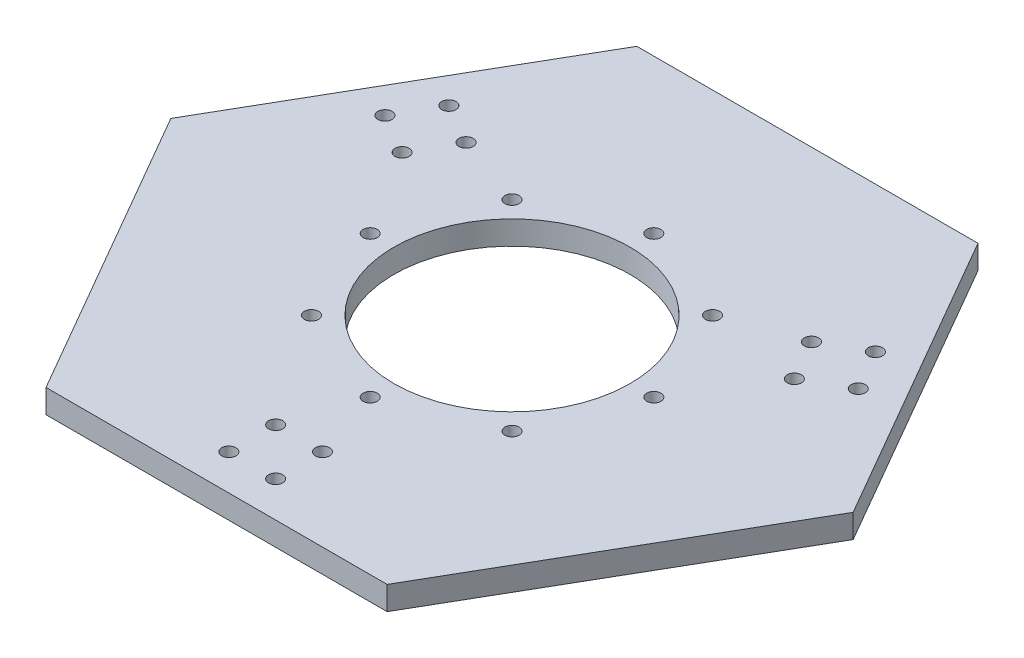
ISO-10303-21;
HEADER;
FILE_DESCRIPTION(('STEP AP214'),'2;1');
FILE_NAME('part.step','',(''),(''),'','','');
FILE_SCHEMA(('AUTOMOTIVE_DESIGN { 1 0 10303 214 1 1 1 1 }'));
ENDSEC;
DATA;
#1=APPLICATION_CONTEXT('core data for automotive mechanical design processes');
#2=APPLICATION_PROTOCOL_DEFINITION('international standard','automotive_design',2000,#1);
#3=PRODUCT_CONTEXT('',#1,'mechanical');
#4=PRODUCT('Part','Part','',(#3));
#5=PRODUCT_RELATED_PRODUCT_CATEGORY('part','',(#4));
#6=PRODUCT_DEFINITION_FORMATION('','',#4);
#7=PRODUCT_DEFINITION_CONTEXT('part definition',#1,'design');
#8=PRODUCT_DEFINITION('design','',#6,#7);
#9=PRODUCT_DEFINITION_SHAPE('','',#8);
#10=(LENGTH_UNIT() NAMED_UNIT(*) SI_UNIT(.MILLI.,.METRE.));
#11=(NAMED_UNIT(*) PLANE_ANGLE_UNIT() SI_UNIT($,.RADIAN.));
#12=(NAMED_UNIT(*) SI_UNIT($,.STERADIAN.) SOLID_ANGLE_UNIT());
#13=UNCERTAINTY_MEASURE_WITH_UNIT(LENGTH_MEASURE(1.E-05),#10,'distance_accuracy_value','');
#14=(GEOMETRIC_REPRESENTATION_CONTEXT(3) GLOBAL_UNCERTAINTY_ASSIGNED_CONTEXT((#13)) GLOBAL_UNIT_ASSIGNED_CONTEXT((#10,
#11,#12)) REPRESENTATION_CONTEXT('',''));
#15=CARTESIAN_POINT('',(0.,0.,0.));
#16=DIRECTION('',(0.,0.,1.));
#17=DIRECTION('',(1.,0.,0.));
#18=AXIS2_PLACEMENT_3D('',#15,#16,#17);
#19=CARTESIAN_POINT('',(72.1687836487032,5.,0.));
#20=DIRECTION('',(-0.866025403784438,0.,0.5));
#21=DIRECTION('',(0.5,0.,0.866025403784439));
#22=AXIS2_PLACEMENT_3D('',#19,#20,#21);
#23=PLANE('',#22);
#24=DIRECTION('',(-0.5,0.,-0.866025403784439));
#25=VECTOR('',#24,1.);
#26=CARTESIAN_POINT('',(72.1687836487032,0.,0.));
#27=LINE('',#26,#25);
#28=CARTESIAN_POINT('',(72.1687836487032,0.,0.));
#29=VERTEX_POINT('',#28);
#30=CARTESIAN_POINT('',(36.0843918243516,0.,-62.5));
#31=VERTEX_POINT('',#30);
#32=EDGE_CURVE('E122',#29,#31,#27,.T.);
#33=ORIENTED_EDGE('',*,*,#32,.T.);
#34=DIRECTION('',(0.,-1.,0.));
#35=VECTOR('',#34,1.);
#36=CARTESIAN_POINT('',(36.0843918243516,5.,-62.5));
#37=LINE('',#36,#35);
#38=CARTESIAN_POINT('',(36.0843918243516,5.,-62.5));
#39=VERTEX_POINT('',#38);
#40=EDGE_CURVE('E11',#39,#31,#37,.T.);
#41=ORIENTED_EDGE('',*,*,#40,.F.);
#42=DIRECTION('',(-0.5,0.,-0.866025403784439));
#43=VECTOR('',#42,1.);
#44=CARTESIAN_POINT('',(72.1687836487032,5.,0.));
#45=LINE('',#44,#43);
#46=CARTESIAN_POINT('',(72.1687836487032,5.,0.));
#47=VERTEX_POINT('',#46);
#48=EDGE_CURVE('E133',#47,#39,#45,.T.);
#49=ORIENTED_EDGE('',*,*,#48,.F.);
#50=DIRECTION('',(0.,-1.,0.));
#51=VECTOR('',#50,1.);
#52=CARTESIAN_POINT('',(72.1687836487032,5.,0.));
#53=LINE('',#52,#51);
#54=EDGE_CURVE('E118',#47,#29,#53,.T.);
#55=ORIENTED_EDGE('',*,*,#54,.T.);
#56=EDGE_LOOP('',(#33,#41,#49,#55));
#57=FACE_BOUND('',#56,.T.);
#58=ADVANCED_FACE('F38',(#57),#23,.F.);
#59=CARTESIAN_POINT('',(36.0843918243516,5.,-62.5));
#60=DIRECTION('',(0.,0.,1.));
#61=DIRECTION('',(1.,0.,0.));
#62=AXIS2_PLACEMENT_3D('',#59,#60,#61);
#63=PLANE('',#62);
#64=DIRECTION('',(-1.,0.,0.));
#65=VECTOR('',#64,1.);
#66=CARTESIAN_POINT('',(36.0843918243516,0.,-62.5));
#67=LINE('',#66,#65);
#68=CARTESIAN_POINT('',(-36.0843918243516,0.,-62.5));
#69=VERTEX_POINT('',#68);
#70=EDGE_CURVE('E125',#31,#69,#67,.T.);
#71=ORIENTED_EDGE('',*,*,#70,.T.);
#72=DIRECTION('',(0.,-1.,0.));
#73=VECTOR('',#72,1.);
#74=CARTESIAN_POINT('',(-36.0843918243516,5.,-62.5));
#75=LINE('',#74,#73);
#76=CARTESIAN_POINT('',(-36.0843918243516,5.,-62.5));
#77=VERTEX_POINT('',#76);
#78=EDGE_CURVE('E46',#77,#69,#75,.T.);
#79=ORIENTED_EDGE('',*,*,#78,.F.);
#80=DIRECTION('',(-1.,0.,0.));
#81=VECTOR('',#80,1.);
#82=CARTESIAN_POINT('',(36.0843918243516,5.,-62.5));
#83=LINE('',#82,#81);
#84=EDGE_CURVE('E91',#39,#77,#83,.T.);
#85=ORIENTED_EDGE('',*,*,#84,.F.);
#86=ORIENTED_EDGE('',*,*,#40,.T.);
#87=EDGE_LOOP('',(#71,#79,#85,#86));
#88=FACE_BOUND('',#87,.T.);
#89=ADVANCED_FACE('F159',(#88),#63,.F.);
#90=CARTESIAN_POINT('',(-36.0843918243516,5.,-62.5));
#91=DIRECTION('',(0.866025403784439,0.,0.5));
#92=DIRECTION('',(0.5,0.,-0.866025403784439));
#93=AXIS2_PLACEMENT_3D('',#90,#91,#92);
#94=PLANE('',#93);
#95=DIRECTION('',(-0.5,0.,0.866025403784439));
#96=VECTOR('',#95,1.);
#97=CARTESIAN_POINT('',(-36.0843918243516,0.,-62.5));
#98=LINE('',#97,#96);
#99=CARTESIAN_POINT('',(-72.1687836487032,0.,0.));
#100=VERTEX_POINT('',#99);
#101=EDGE_CURVE('E128',#69,#100,#98,.T.);
#102=ORIENTED_EDGE('',*,*,#101,.T.);
#103=DIRECTION('',(0.,-1.,0.));
#104=VECTOR('',#103,1.);
#105=CARTESIAN_POINT('',(-72.1687836487032,5.,0.));
#106=LINE('',#105,#104);
#107=CARTESIAN_POINT('',(-72.1687836487032,5.,0.));
#108=VERTEX_POINT('',#107);
#109=EDGE_CURVE('E113',#108,#100,#106,.T.);
#110=ORIENTED_EDGE('',*,*,#109,.F.);
#111=DIRECTION('',(-0.5,0.,0.866025403784439));
#112=VECTOR('',#111,1.);
#113=CARTESIAN_POINT('',(-36.0843918243516,5.,-62.5));
#114=LINE('',#113,#112);
#115=EDGE_CURVE('E104',#77,#108,#114,.T.);
#116=ORIENTED_EDGE('',*,*,#115,.F.);
#117=ORIENTED_EDGE('',*,*,#78,.T.);
#118=EDGE_LOOP('',(#102,#110,#116,#117));
#119=FACE_BOUND('',#118,.T.);
#120=ADVANCED_FACE('F139',(#119),#94,.F.);
#121=CARTESIAN_POINT('',(-72.1687836487032,5.,0.));
#122=DIRECTION('',(0.866025403784438,0.,-0.5));
#123=DIRECTION('',(-0.5,0.,-0.866025403784438));
#124=AXIS2_PLACEMENT_3D('',#121,#122,#123);
#125=PLANE('',#124);
#126=DIRECTION('',(0.5,0.,0.866025403784438));
#127=VECTOR('',#126,1.);
#128=CARTESIAN_POINT('',(-72.1687836487032,0.,0.));
#129=LINE('',#128,#127);
#130=CARTESIAN_POINT('',(-36.0843918243516,0.,62.5000000000001));
#131=VERTEX_POINT('',#130);
#132=EDGE_CURVE('E112',#100,#131,#129,.T.);
#133=ORIENTED_EDGE('',*,*,#132,.T.);
#134=DIRECTION('',(0.,-1.,0.));
#135=VECTOR('',#134,1.);
#136=CARTESIAN_POINT('',(-36.0843918243516,5.,62.5000000000001));
#137=LINE('',#136,#135);
#138=CARTESIAN_POINT('',(-36.0843918243516,5.,62.5000000000001));
#139=VERTEX_POINT('',#138);
#140=EDGE_CURVE('E109',#139,#131,#137,.T.);
#141=ORIENTED_EDGE('',*,*,#140,.F.);
#142=DIRECTION('',(0.5,0.,0.866025403784438));
#143=VECTOR('',#142,1.);
#144=CARTESIAN_POINT('',(-72.1687836487032,5.,0.));
#145=LINE('',#144,#143);
#146=EDGE_CURVE('E98',#108,#139,#145,.T.);
#147=ORIENTED_EDGE('',*,*,#146,.F.);
#148=ORIENTED_EDGE('',*,*,#109,.T.);
#149=EDGE_LOOP('',(#133,#141,#147,#148));
#150=FACE_BOUND('',#149,.T.);
#151=ADVANCED_FACE('F110',(#150),#125,.F.);
#152=CARTESIAN_POINT('',(-36.0843918243516,5.,62.5000000000001));
#153=DIRECTION('',(0.,0.,-1.));
#154=DIRECTION('',(-1.,0.,0.));
#155=AXIS2_PLACEMENT_3D('',#152,#153,#154);
#156=PLANE('',#155);
#157=DIRECTION('',(1.,0.,0.));
#158=VECTOR('',#157,1.);
#159=CARTESIAN_POINT('',(-36.0843918243516,0.,62.5000000000001));
#160=LINE('',#159,#158);
#161=CARTESIAN_POINT('',(36.0843918243516,0.,62.5));
#162=VERTEX_POINT('',#161);
#163=EDGE_CURVE('E77',#131,#162,#160,.T.);
#164=ORIENTED_EDGE('',*,*,#163,.T.);
#165=DIRECTION('',(0.,-1.,0.));
#166=VECTOR('',#165,1.);
#167=CARTESIAN_POINT('',(36.0843918243516,5.,62.5));
#168=LINE('',#167,#166);
#169=CARTESIAN_POINT('',(36.0843918243516,5.,62.5));
#170=VERTEX_POINT('',#169);
#171=EDGE_CURVE('E114',#170,#162,#168,.T.);
#172=ORIENTED_EDGE('',*,*,#171,.F.);
#173=DIRECTION('',(1.,0.,0.));
#174=VECTOR('',#173,1.);
#175=CARTESIAN_POINT('',(-36.0843918243516,5.,62.5000000000001));
#176=LINE('',#175,#174);
#177=EDGE_CURVE('E102',#139,#170,#176,.T.);
#178=ORIENTED_EDGE('',*,*,#177,.F.);
#179=ORIENTED_EDGE('',*,*,#140,.T.);
#180=EDGE_LOOP('',(#164,#172,#178,#179));
#181=FACE_BOUND('',#180,.T.);
#182=ADVANCED_FACE('F116',(#181),#156,.F.);
#183=CARTESIAN_POINT('',(36.0843918243516,5.,62.5));
#184=DIRECTION('',(-0.866025403784439,0.,-0.5));
#185=DIRECTION('',(-0.5,0.,0.866025403784439));
#186=AXIS2_PLACEMENT_3D('',#183,#184,#185);
#187=PLANE('',#186);
#188=DIRECTION('',(0.5,0.,-0.866025403784439));
#189=VECTOR('',#188,1.);
#190=CARTESIAN_POINT('',(36.0843918243516,0.,62.5));
#191=LINE('',#190,#189);
#192=EDGE_CURVE('E83',#162,#29,#191,.T.);
#193=ORIENTED_EDGE('',*,*,#192,.T.);
#194=ORIENTED_EDGE('',*,*,#54,.F.);
#195=DIRECTION('',(0.5,0.,-0.866025403784439));
#196=VECTOR('',#195,1.);
#197=CARTESIAN_POINT('',(36.0843918243516,5.,62.5));
#198=LINE('',#197,#196);
#199=EDGE_CURVE('E54',#170,#47,#198,.T.);
#200=ORIENTED_EDGE('',*,*,#199,.F.);
#201=ORIENTED_EDGE('',*,*,#171,.T.);
#202=EDGE_LOOP('',(#193,#194,#200,#201));
#203=FACE_BOUND('',#202,.T.);
#204=ADVANCED_FACE('F146',(#203),#187,.F.);
#205=CARTESIAN_POINT('',(0.,5.,0.));
#206=DIRECTION('',(0.,1.,0.));
#207=DIRECTION('',(0.,0.,1.));
#208=AXIS2_PLACEMENT_3D('',#205,#206,#207);
#209=PLANE('',#208);
#210=CARTESIAN_POINT('',(30.,5.,-1.04744440165294E-13));
#211=DIRECTION('',(0.,1.,0.));
#212=DIRECTION('',(0.,0.,1.));
#213=AXIS2_PLACEMENT_3D('',#210,#211,#212);
#214=CIRCLE('',#213,1.5);
#215=CARTESIAN_POINT('',(30.,5.,1.4999999999999));
#216=VERTEX_POINT('',#215);
#217=EDGE_CURVE('E483',#216,#216,#214,.T.);
#218=ORIENTED_EDGE('',*,*,#217,.F.);
#219=EDGE_LOOP('',(#218));
#220=FACE_BOUND('',#219,.T.);
#221=CARTESIAN_POINT('',(21.2132034355963,5.,-21.2132034355965));
#222=DIRECTION('',(0.,1.,0.));
#223=DIRECTION('',(0.,0.,1.));
#224=AXIS2_PLACEMENT_3D('',#221,#222,#223);
#225=CIRCLE('',#224,1.5);
#226=CARTESIAN_POINT('',(21.2132034355963,5.,-19.7132034355965));
#227=VERTEX_POINT('',#226);
#228=EDGE_CURVE('E520',#227,#227,#225,.T.);
#229=ORIENTED_EDGE('',*,*,#228,.F.);
#230=EDGE_LOOP('',(#229));
#231=FACE_BOUND('',#230,.T.);
#232=CARTESIAN_POINT('',(0.,5.,-30.));
#233=DIRECTION('',(0.,1.,0.));
#234=DIRECTION('',(0.,0.,1.));
#235=AXIS2_PLACEMENT_3D('',#232,#233,#234);
#236=CIRCLE('',#235,1.5);
#237=CARTESIAN_POINT('',(0.,5.,-28.5));
#238=VERTEX_POINT('',#237);
#239=EDGE_CURVE('E517',#238,#238,#236,.T.);
#240=ORIENTED_EDGE('',*,*,#239,.F.);
#241=EDGE_LOOP('',(#240));
#242=FACE_BOUND('',#241,.T.);
#243=CARTESIAN_POINT('',(-21.2132034355966,5.,-21.2132034355962));
#244=DIRECTION('',(0.,1.,0.));
#245=DIRECTION('',(0.,0.,1.));
#246=AXIS2_PLACEMENT_3D('',#243,#244,#245);
#247=CIRCLE('',#246,1.5);
#248=CARTESIAN_POINT('',(-21.2132034355966,5.,-19.7132034355962));
#249=VERTEX_POINT('',#248);
#250=EDGE_CURVE('E514',#249,#249,#247,.T.);
#251=ORIENTED_EDGE('',*,*,#250,.F.);
#252=EDGE_LOOP('',(#251));
#253=FACE_BOUND('',#252,.T.);
#254=CARTESIAN_POINT('',(-30.,5.,3.14233320495882E-13));
#255=DIRECTION('',(0.,1.,0.));
#256=DIRECTION('',(0.,0.,1.));
#257=AXIS2_PLACEMENT_3D('',#254,#255,#256);
#258=CIRCLE('',#257,1.5);
#259=CARTESIAN_POINT('',(-30.,5.,1.50000000000032));
#260=VERTEX_POINT('',#259);
#261=EDGE_CURVE('E511',#260,#260,#258,.T.);
#262=ORIENTED_EDGE('',*,*,#261,.F.);
#263=EDGE_LOOP('',(#262));
#264=FACE_BOUND('',#263,.T.);
#265=CARTESIAN_POINT('',(-21.2132034355962,5.,21.2132034355967));
#266=DIRECTION('',(0.,1.,0.));
#267=DIRECTION('',(0.,0.,1.));
#268=AXIS2_PLACEMENT_3D('',#265,#266,#267);
#269=CIRCLE('',#268,1.5);
#270=CARTESIAN_POINT('',(-21.2132034355962,5.,22.7132034355967));
#271=VERTEX_POINT('',#270);
#272=EDGE_CURVE('E508',#271,#271,#269,.T.);
#273=ORIENTED_EDGE('',*,*,#272,.F.);
#274=EDGE_LOOP('',(#273));
#275=FACE_BOUND('',#274,.T.);
#276=CARTESIAN_POINT('',(21.2132034355965,5.,21.2132034355964));
#277=DIRECTION('',(0.,1.,0.));
#278=DIRECTION('',(0.,0.,1.));
#279=AXIS2_PLACEMENT_3D('',#276,#277,#278);
#280=CIRCLE('',#279,1.5);
#281=CARTESIAN_POINT('',(21.2132034355965,5.,22.7132034355964));
#282=VERTEX_POINT('',#281);
#283=EDGE_CURVE('E491',#282,#282,#280,.T.);
#284=ORIENTED_EDGE('',*,*,#283,.F.);
#285=EDGE_LOOP('',(#284));
#286=FACE_BOUND('',#285,.T.);
#287=CARTESIAN_POINT('',(0.,5.,30.));
#288=DIRECTION('',(0.,1.,0.));
#289=DIRECTION('',(0.,0.,1.));
#290=AXIS2_PLACEMENT_3D('',#287,#288,#289);
#291=CIRCLE('',#290,1.5);
#292=CARTESIAN_POINT('',(0.,5.,31.5));
#293=VERTEX_POINT('',#292);
#294=EDGE_CURVE('E527',#293,#293,#291,.T.);
#295=ORIENTED_EDGE('',*,*,#294,.F.);
#296=EDGE_LOOP('',(#295));
#297=FACE_BOUND('',#296,.T.);
#298=CARTESIAN_POINT('',(41.4894444404891,5.,-18.2381742512666));
#299=DIRECTION('',(0.,1.,0.));
#300=DIRECTION('',(0.866025403784443,0.,-0.499999999999992));
#301=AXIS2_PLACEMENT_3D('',#298,#299,#300);
#302=CIRCLE('',#301,1.5);
#303=CARTESIAN_POINT('',(42.7884825461658,5.,-18.9881742512666));
#304=VERTEX_POINT('',#303);
#305=EDGE_CURVE('E534',#304,#304,#302,.T.);
#306=ORIENTED_EDGE('',*,*,#305,.F.);
#307=EDGE_LOOP('',(#306));
#308=FACE_BOUND('',#307,.T.);
#309=CARTESIAN_POINT('',(-50.0630959379548,5.,-23.1881742512673));
#310=DIRECTION('',(0.,1.,0.));
#311=DIRECTION('',(-0.866025403784436,0.,-0.500000000000004));
#312=AXIS2_PLACEMENT_3D('',#309,#310,#311);
#313=CIRCLE('',#312,1.5);
#314=CARTESIAN_POINT('',(-51.3621340436315,5.,-23.9381742512673));
#315=VERTEX_POINT('',#314);
#316=EDGE_CURVE('E553',#315,#315,#313,.T.);
#317=ORIENTED_EDGE('',*,*,#316,.F.);
#318=EDGE_LOOP('',(#317));
#319=FACE_BOUND('',#318,.T.);
#320=CARTESIAN_POINT('',(-45.1130959379548,5.,-31.7618257487332));
#321=DIRECTION('',(0.,1.,0.));
#322=DIRECTION('',(-0.866025403784436,0.,-0.500000000000004));
#323=AXIS2_PLACEMENT_3D('',#320,#321,#322);
#324=CIRCLE('',#323,1.5);
#325=CARTESIAN_POINT('',(-46.4121340436314,5.,-32.5118257487332));
#326=VERTEX_POINT('',#325);
#327=EDGE_CURVE('E552',#326,#326,#324,.T.);
#328=ORIENTED_EDGE('',*,*,#327,.F.);
#329=EDGE_LOOP('',(#328));
#330=FACE_BOUND('',#329,.T.);
#331=CARTESIAN_POINT('',(-41.4894444404889,5.,-18.2381742512672));
#332=DIRECTION('',(0.,1.,0.));
#333=DIRECTION('',(-0.866025403784436,0.,-0.500000000000004));
#334=AXIS2_PLACEMENT_3D('',#331,#332,#333);
#335=CIRCLE('',#334,1.5);
#336=CARTESIAN_POINT('',(-42.7884825461655,5.,-18.9881742512672));
#337=VERTEX_POINT('',#336);
#338=EDGE_CURVE('E565',#337,#337,#335,.T.);
#339=ORIENTED_EDGE('',*,*,#338,.F.);
#340=EDGE_LOOP('',(#339));
#341=FACE_BOUND('',#340,.T.);
#342=CARTESIAN_POINT('',(36.5394444404892,5.,-26.8118257487326));
#343=DIRECTION('',(0.,1.,0.));
#344=DIRECTION('',(0.866025403784443,0.,-0.499999999999992));
#345=AXIS2_PLACEMENT_3D('',#342,#343,#344);
#346=CIRCLE('',#345,1.5);
#347=CARTESIAN_POINT('',(37.8384825461659,5.,-27.5618257487326));
#348=VERTEX_POINT('',#347);
#349=EDGE_CURVE('E535',#348,#348,#346,.T.);
#350=ORIENTED_EDGE('',*,*,#349,.F.);
#351=EDGE_LOOP('',(#350));
#352=FACE_BOUND('',#351,.T.);
#353=CARTESIAN_POINT('',(50.0630959379551,5.,-23.1881742512666));
#354=DIRECTION('',(0.,1.,0.));
#355=DIRECTION('',(0.866025403784443,0.,-0.499999999999992));
#356=AXIS2_PLACEMENT_3D('',#353,#354,#355);
#357=CIRCLE('',#356,1.5);
#358=CARTESIAN_POINT('',(51.3621340436318,5.,-23.9381742512666));
#359=VERTEX_POINT('',#358);
#360=EDGE_CURVE('E541',#359,#359,#357,.T.);
#361=ORIENTED_EDGE('',*,*,#360,.F.);
#362=EDGE_LOOP('',(#361));
#363=FACE_BOUND('',#362,.T.);
#364=CARTESIAN_POINT('',(45.1130959379552,5.,-31.7618257487326));
#365=DIRECTION('',(0.,1.,0.));
#366=DIRECTION('',(0.866025403784443,0.,-0.499999999999992));
#367=AXIS2_PLACEMENT_3D('',#364,#365,#366);
#368=CIRCLE('',#367,1.5);
#369=CARTESIAN_POINT('',(46.4121340436319,5.,-32.5118257487325));
#370=VERTEX_POINT('',#369);
#371=EDGE_CURVE('E530',#370,#370,#368,.T.);
#372=ORIENTED_EDGE('',*,*,#371,.F.);
#373=EDGE_LOOP('',(#372));
#374=FACE_BOUND('',#373,.T.);
#375=CARTESIAN_POINT('',(-36.5394444404888,5.,-26.8118257487331));
#376=DIRECTION('',(0.,1.,0.));
#377=DIRECTION('',(-0.866025403784436,0.,-0.500000000000004));
#378=AXIS2_PLACEMENT_3D('',#375,#376,#377);
#379=CIRCLE('',#378,1.5);
#380=CARTESIAN_POINT('',(-37.8384825461655,5.,-27.5618257487331));
#381=VERTEX_POINT('',#380);
#382=EDGE_CURVE('E564',#381,#381,#379,.T.);
#383=ORIENTED_EDGE('',*,*,#382,.F.);
#384=EDGE_LOOP('',(#383));
#385=FACE_BOUND('',#384,.T.);
#386=CARTESIAN_POINT('',(4.95,5.,45.05));
#387=DIRECTION('',(0.,1.,0.));
#388=DIRECTION('',(0.,0.,1.));
#389=AXIS2_PLACEMENT_3D('',#386,#387,#388);
#390=CIRCLE('',#389,1.5);
#391=CARTESIAN_POINT('',(4.95,5.,46.55));
#392=VERTEX_POINT('',#391);
#393=EDGE_CURVE('E585',#392,#392,#390,.T.);
#394=ORIENTED_EDGE('',*,*,#393,.F.);
#395=EDGE_LOOP('',(#394));
#396=FACE_BOUND('',#395,.T.);
#397=CARTESIAN_POINT('',(-4.95,5.,54.95));
#398=DIRECTION('',(0.,1.,0.));
#399=DIRECTION('',(0.,0.,1.));
#400=AXIS2_PLACEMENT_3D('',#397,#398,#399);
#401=CIRCLE('',#400,1.5);
#402=CARTESIAN_POINT('',(-4.95,5.,56.45));
#403=VERTEX_POINT('',#402);
#404=EDGE_CURVE('E592',#403,#403,#401,.T.);
#405=ORIENTED_EDGE('',*,*,#404,.F.);
#406=EDGE_LOOP('',(#405));
#407=FACE_BOUND('',#406,.T.);
#408=CARTESIAN_POINT('',(4.95,5.,54.95));
#409=DIRECTION('',(0.,1.,0.));
#410=DIRECTION('',(0.,0.,1.));
#411=AXIS2_PLACEMENT_3D('',#408,#409,#410);
#412=CIRCLE('',#411,1.5);
#413=CARTESIAN_POINT('',(4.95,5.,56.45));
#414=VERTEX_POINT('',#413);
#415=EDGE_CURVE('E579',#414,#414,#412,.T.);
#416=ORIENTED_EDGE('',*,*,#415,.F.);
#417=EDGE_LOOP('',(#416));
#418=FACE_BOUND('',#417,.T.);
#419=CARTESIAN_POINT('',(-4.95,5.,45.05));
#420=DIRECTION('',(0.,1.,0.));
#421=DIRECTION('',(0.,0.,1.));
#422=AXIS2_PLACEMENT_3D('',#419,#420,#421);
#423=CIRCLE('',#422,1.5);
#424=CARTESIAN_POINT('',(-4.95,5.,46.55));
#425=VERTEX_POINT('',#424);
#426=EDGE_CURVE('E588',#425,#425,#423,.T.);
#427=ORIENTED_EDGE('',*,*,#426,.F.);
#428=EDGE_LOOP('',(#427));
#429=FACE_BOUND('',#428,.T.);
#430=CARTESIAN_POINT('',(0.,5.,0.));
#431=DIRECTION('',(0.,1.,0.));
#432=DIRECTION('',(0.,0.,1.));
#433=AXIS2_PLACEMENT_3D('',#430,#431,#432);
#434=CIRCLE('',#433,25.);
#435=CARTESIAN_POINT('',(0.,5.,25.));
#436=VERTEX_POINT('',#435);
#437=EDGE_CURVE('E600',#436,#436,#434,.T.);
#438=ORIENTED_EDGE('',*,*,#437,.F.);
#439=EDGE_LOOP('',(#438));
#440=FACE_BOUND('',#439,.T.);
#441=ORIENTED_EDGE('',*,*,#48,.T.);
#442=ORIENTED_EDGE('',*,*,#84,.T.);
#443=ORIENTED_EDGE('',*,*,#115,.T.);
#444=ORIENTED_EDGE('',*,*,#146,.T.);
#445=ORIENTED_EDGE('',*,*,#177,.T.);
#446=ORIENTED_EDGE('',*,*,#199,.T.);
#447=EDGE_LOOP('',(#441,#442,#443,#444,#445,#446));
#448=FACE_BOUND('',#447,.T.);
#449=ADVANCED_FACE('F100',(#220,#231,#242,#253,#264,#275,#286,#297,#308,#319,#330,#341,#352,
#363,#374,#385,#396,#407,#418,#429,#440,#448),#209,.T.);
#450=CARTESIAN_POINT('',(0.,0.,0.));
#451=DIRECTION('',(0.,1.,0.));
#452=DIRECTION('',(0.,0.,1.));
#453=AXIS2_PLACEMENT_3D('',#450,#451,#452);
#454=PLANE('',#453);
#455=CARTESIAN_POINT('',(30.,0.,-1.04744440165294E-13));
#456=DIRECTION('',(0.,-1.,0.));
#457=DIRECTION('',(-1.,0.,0.));
#458=AXIS2_PLACEMENT_3D('',#455,#456,#457);
#459=CIRCLE('',#458,1.5);
#460=CARTESIAN_POINT('',(28.5,0.,0.));
#461=VERTEX_POINT('',#460);
#462=EDGE_CURVE('E486',#461,#461,#459,.T.);
#463=ORIENTED_EDGE('',*,*,#462,.F.);
#464=EDGE_LOOP('',(#463));
#465=FACE_BOUND('',#464,.T.);
#466=CARTESIAN_POINT('',(21.2132034355963,0.,-21.2132034355965));
#467=DIRECTION('',(0.,-1.,0.));
#468=DIRECTION('',(-0.707106781186544,0.,0.707106781186551));
#469=AXIS2_PLACEMENT_3D('',#466,#467,#468);
#470=CIRCLE('',#469,1.5);
#471=CARTESIAN_POINT('',(20.1525432638165,0.,-20.1525432638167));
#472=VERTEX_POINT('',#471);
#473=EDGE_CURVE('E488',#472,#472,#470,.T.);
#474=ORIENTED_EDGE('',*,*,#473,.F.);
#475=EDGE_LOOP('',(#474));
#476=FACE_BOUND('',#475,.T.);
#477=CARTESIAN_POINT('',(0.,0.,-30.));
#478=DIRECTION('',(0.,-1.,0.));
#479=DIRECTION('',(0.,0.,1.));
#480=AXIS2_PLACEMENT_3D('',#477,#478,#479);
#481=CIRCLE('',#480,1.5);
#482=CARTESIAN_POINT('',(0.,0.,-28.5));
#483=VERTEX_POINT('',#482);
#484=EDGE_CURVE('E494',#483,#483,#481,.T.);
#485=ORIENTED_EDGE('',*,*,#484,.F.);
#486=EDGE_LOOP('',(#485));
#487=FACE_BOUND('',#486,.T.);
#488=CARTESIAN_POINT('',(-21.2132034355966,0.,-21.2132034355962));
#489=DIRECTION('',(0.,-1.,0.));
#490=DIRECTION('',(0.707106781186554,0.,0.707106781186541));
#491=AXIS2_PLACEMENT_3D('',#488,#489,#490);
#492=CIRCLE('',#491,1.5);
#493=CARTESIAN_POINT('',(-20.1525432638168,0.,-20.1525432638164));
#494=VERTEX_POINT('',#493);
#495=EDGE_CURVE('E502',#494,#494,#492,.T.);
#496=ORIENTED_EDGE('',*,*,#495,.F.);
#497=EDGE_LOOP('',(#496));
#498=FACE_BOUND('',#497,.T.);
#499=CARTESIAN_POINT('',(-30.,0.,3.14233320495882E-13));
#500=DIRECTION('',(0.,-1.,0.));
#501=DIRECTION('',(1.,0.,0.));
#502=AXIS2_PLACEMENT_3D('',#499,#500,#501);
#503=CIRCLE('',#502,1.5);
#504=CARTESIAN_POINT('',(-28.5,0.,2.98521654471088E-13));
#505=VERTEX_POINT('',#504);
#506=EDGE_CURVE('E504',#505,#505,#503,.T.);
#507=ORIENTED_EDGE('',*,*,#506,.F.);
#508=EDGE_LOOP('',(#507));
#509=FACE_BOUND('',#508,.T.);
#510=CARTESIAN_POINT('',(-21.2132034355962,0.,21.2132034355967));
#511=DIRECTION('',(0.,-1.,0.));
#512=DIRECTION('',(0.707106781186539,0.,-0.707106781186556));
#513=AXIS2_PLACEMENT_3D('',#510,#511,#512);
#514=CIRCLE('',#513,1.5);
#515=CARTESIAN_POINT('',(-20.1525432638164,0.,20.1525432638168));
#516=VERTEX_POINT('',#515);
#517=EDGE_CURVE('E497',#516,#516,#514,.T.);
#518=ORIENTED_EDGE('',*,*,#517,.F.);
#519=EDGE_LOOP('',(#518));
#520=FACE_BOUND('',#519,.T.);
#521=CARTESIAN_POINT('',(21.2132034355965,0.,21.2132034355964));
#522=DIRECTION('',(0.,-1.,0.));
#523=DIRECTION('',(-0.707106781186549,0.,-0.707106781186546));
#524=AXIS2_PLACEMENT_3D('',#521,#522,#523);
#525=CIRCLE('',#524,1.5);
#526=CARTESIAN_POINT('',(20.1525432638166,0.,20.1525432638166));
#527=VERTEX_POINT('',#526);
#528=EDGE_CURVE('E487',#527,#527,#525,.T.);
#529=ORIENTED_EDGE('',*,*,#528,.F.);
#530=EDGE_LOOP('',(#529));
#531=FACE_BOUND('',#530,.T.);
#532=CARTESIAN_POINT('',(0.,0.,30.));
#533=DIRECTION('',(0.,-1.,0.));
#534=DIRECTION('',(0.,0.,-1.));
#535=AXIS2_PLACEMENT_3D('',#532,#533,#534);
#536=CIRCLE('',#535,1.5);
#537=CARTESIAN_POINT('',(0.,0.,28.5));
#538=VERTEX_POINT('',#537);
#539=EDGE_CURVE('E524',#538,#538,#536,.T.);
#540=ORIENTED_EDGE('',*,*,#539,.F.);
#541=EDGE_LOOP('',(#540));
#542=FACE_BOUND('',#541,.T.);
#543=CARTESIAN_POINT('',(41.4894444404891,0.,-18.2381742512666));
#544=DIRECTION('',(0.,1.,0.));
#545=DIRECTION('',(0.866025403784443,0.,-0.499999999999992));
#546=AXIS2_PLACEMENT_3D('',#543,#544,#545);
#547=CIRCLE('',#546,1.5);
#548=CARTESIAN_POINT('',(42.7884825461658,0.,-18.9881742512666));
#549=VERTEX_POINT('',#548);
#550=EDGE_CURVE('E556',#549,#549,#547,.T.);
#551=ORIENTED_EDGE('',*,*,#550,.T.);
#552=EDGE_LOOP('',(#551));
#553=FACE_BOUND('',#552,.T.);
#554=CARTESIAN_POINT('',(-50.0630959379548,0.,-23.1881742512673));
#555=DIRECTION('',(0.,1.,0.));
#556=DIRECTION('',(-0.866025403784436,0.,-0.500000000000004));
#557=AXIS2_PLACEMENT_3D('',#554,#555,#556);
#558=CIRCLE('',#557,1.5);
#559=CARTESIAN_POINT('',(-51.3621340436315,0.,-23.9381742512673));
#560=VERTEX_POINT('',#559);
#561=EDGE_CURVE('E549',#560,#560,#558,.T.);
#562=ORIENTED_EDGE('',*,*,#561,.T.);
#563=EDGE_LOOP('',(#562));
#564=FACE_BOUND('',#563,.T.);
#565=CARTESIAN_POINT('',(-45.1130959379548,0.,-31.7618257487332));
#566=DIRECTION('',(0.,1.,0.));
#567=DIRECTION('',(-0.866025403784436,0.,-0.500000000000004));
#568=AXIS2_PLACEMENT_3D('',#565,#566,#567);
#569=CIRCLE('',#568,1.5);
#570=CARTESIAN_POINT('',(-46.4121340436314,0.,-32.5118257487332));
#571=VERTEX_POINT('',#570);
#572=EDGE_CURVE('E568',#571,#571,#569,.T.);
#573=ORIENTED_EDGE('',*,*,#572,.T.);
#574=EDGE_LOOP('',(#573));
#575=FACE_BOUND('',#574,.T.);
#576=CARTESIAN_POINT('',(-41.4894444404889,0.,-18.2381742512672));
#577=DIRECTION('',(0.,1.,0.));
#578=DIRECTION('',(-0.866025403784436,0.,-0.500000000000004));
#579=AXIS2_PLACEMENT_3D('',#576,#577,#578);
#580=CIRCLE('',#579,1.5);
#581=CARTESIAN_POINT('',(-42.7884825461655,0.,-18.9881742512672));
#582=VERTEX_POINT('',#581);
#583=EDGE_CURVE('E561',#582,#582,#580,.T.);
#584=ORIENTED_EDGE('',*,*,#583,.T.);
#585=EDGE_LOOP('',(#584));
#586=FACE_BOUND('',#585,.T.);
#587=CARTESIAN_POINT('',(36.5394444404892,0.,-26.8118257487326));
#588=DIRECTION('',(0.,1.,0.));
#589=DIRECTION('',(0.866025403784443,0.,-0.499999999999992));
#590=AXIS2_PLACEMENT_3D('',#587,#588,#589);
#591=CIRCLE('',#590,1.5);
#592=CARTESIAN_POINT('',(37.8384825461659,0.,-27.5618257487326));
#593=VERTEX_POINT('',#592);
#594=EDGE_CURVE('E531',#593,#593,#591,.T.);
#595=ORIENTED_EDGE('',*,*,#594,.T.);
#596=EDGE_LOOP('',(#595));
#597=FACE_BOUND('',#596,.T.);
#598=CARTESIAN_POINT('',(50.0630959379551,0.,-23.1881742512666));
#599=DIRECTION('',(0.,1.,0.));
#600=DIRECTION('',(0.866025403784443,0.,-0.499999999999992));
#601=AXIS2_PLACEMENT_3D('',#598,#599,#600);
#602=CIRCLE('',#601,1.5);
#603=CARTESIAN_POINT('',(51.3621340436318,0.,-23.9381742512666));
#604=VERTEX_POINT('',#603);
#605=EDGE_CURVE('E538',#604,#604,#602,.T.);
#606=ORIENTED_EDGE('',*,*,#605,.T.);
#607=EDGE_LOOP('',(#606));
#608=FACE_BOUND('',#607,.T.);
#609=CARTESIAN_POINT('',(45.1130959379552,0.,-31.7618257487326));
#610=DIRECTION('',(0.,1.,0.));
#611=DIRECTION('',(0.866025403784443,0.,-0.499999999999992));
#612=AXIS2_PLACEMENT_3D('',#609,#610,#611);
#613=CIRCLE('',#612,1.5);
#614=CARTESIAN_POINT('',(46.4121340436319,0.,-32.5118257487325));
#615=VERTEX_POINT('',#614);
#616=EDGE_CURVE('E544',#615,#615,#613,.T.);
#617=ORIENTED_EDGE('',*,*,#616,.T.);
#618=EDGE_LOOP('',(#617));
#619=FACE_BOUND('',#618,.T.);
#620=CARTESIAN_POINT('',(-36.5394444404888,0.,-26.8118257487331));
#621=DIRECTION('',(0.,1.,0.));
#622=DIRECTION('',(-0.866025403784436,0.,-0.500000000000004));
#623=AXIS2_PLACEMENT_3D('',#620,#621,#622);
#624=CIRCLE('',#623,1.5);
#625=CARTESIAN_POINT('',(-37.8384825461655,0.,-27.5618257487331));
#626=VERTEX_POINT('',#625);
#627=EDGE_CURVE('E573',#626,#626,#624,.T.);
#628=ORIENTED_EDGE('',*,*,#627,.T.);
#629=EDGE_LOOP('',(#628));
#630=FACE_BOUND('',#629,.T.);
#631=CARTESIAN_POINT('',(4.95,0.,45.05));
#632=DIRECTION('',(0.,1.,0.));
#633=DIRECTION('',(0.,0.,1.));
#634=AXIS2_PLACEMENT_3D('',#631,#632,#633);
#635=CIRCLE('',#634,1.5);
#636=CARTESIAN_POINT('',(4.95,0.,46.55));
#637=VERTEX_POINT('',#636);
#638=EDGE_CURVE('E589',#637,#637,#635,.T.);
#639=ORIENTED_EDGE('',*,*,#638,.T.);
#640=EDGE_LOOP('',(#639));
#641=FACE_BOUND('',#640,.T.);
#642=CARTESIAN_POINT('',(-4.95,0.,54.95));
#643=DIRECTION('',(0.,1.,0.));
#644=DIRECTION('',(0.,0.,1.));
#645=AXIS2_PLACEMENT_3D('',#642,#643,#644);
#646=CIRCLE('',#645,1.5);
#647=CARTESIAN_POINT('',(-4.95,0.,56.45));
#648=VERTEX_POINT('',#647);
#649=EDGE_CURVE('E582',#648,#648,#646,.T.);
#650=ORIENTED_EDGE('',*,*,#649,.T.);
#651=EDGE_LOOP('',(#650));
#652=FACE_BOUND('',#651,.T.);
#653=CARTESIAN_POINT('',(4.95,0.,54.95));
#654=DIRECTION('',(0.,1.,0.));
#655=DIRECTION('',(0.,0.,1.));
#656=AXIS2_PLACEMENT_3D('',#653,#654,#655);
#657=CIRCLE('',#656,1.5);
#658=CARTESIAN_POINT('',(4.95,0.,56.45));
#659=VERTEX_POINT('',#658);
#660=EDGE_CURVE('E576',#659,#659,#657,.T.);
#661=ORIENTED_EDGE('',*,*,#660,.T.);
#662=EDGE_LOOP('',(#661));
#663=FACE_BOUND('',#662,.T.);
#664=CARTESIAN_POINT('',(-4.95,0.,45.05));
#665=DIRECTION('',(0.,1.,0.));
#666=DIRECTION('',(0.,0.,1.));
#667=AXIS2_PLACEMENT_3D('',#664,#665,#666);
#668=CIRCLE('',#667,1.5);
#669=CARTESIAN_POINT('',(-4.95,0.,46.55));
#670=VERTEX_POINT('',#669);
#671=EDGE_CURVE('E597',#670,#670,#668,.T.);
#672=ORIENTED_EDGE('',*,*,#671,.T.);
#673=EDGE_LOOP('',(#672));
#674=FACE_BOUND('',#673,.T.);
#675=CARTESIAN_POINT('',(0.,0.,0.));
#676=DIRECTION('',(0.,1.,0.));
#677=DIRECTION('',(0.,0.,1.));
#678=AXIS2_PLACEMENT_3D('',#675,#676,#677);
#679=CIRCLE('',#678,25.);
#680=CARTESIAN_POINT('',(0.,0.,25.));
#681=VERTEX_POINT('',#680);
#682=EDGE_CURVE('E126',#681,#681,#679,.T.);
#683=ORIENTED_EDGE('',*,*,#682,.T.);
#684=EDGE_LOOP('',(#683));
#685=FACE_BOUND('',#684,.T.);
#686=ORIENTED_EDGE('',*,*,#32,.F.);
#687=ORIENTED_EDGE('',*,*,#192,.F.);
#688=ORIENTED_EDGE('',*,*,#163,.F.);
#689=ORIENTED_EDGE('',*,*,#132,.F.);
#690=ORIENTED_EDGE('',*,*,#101,.F.);
#691=ORIENTED_EDGE('',*,*,#70,.F.);
#692=EDGE_LOOP('',(#686,#687,#688,#689,#690,#691));
#693=FACE_BOUND('',#692,.T.);
#694=ADVANCED_FACE('F142',(#465,#476,#487,#498,#509,#520,#531,#542,#553,#564,#575,#586,#597,
#608,#619,#630,#641,#652,#663,#674,#685,#693),#454,.F.);
#695=CARTESIAN_POINT('',(0.,0.,0.));
#696=DIRECTION('',(0.,1.,0.));
#697=DIRECTION('',(0.,0.,1.));
#698=AXIS2_PLACEMENT_3D('',#695,#696,#697);
#699=CYLINDRICAL_SURFACE('',#698,25.);
#700=ORIENTED_EDGE('',*,*,#682,.F.);
#701=EDGE_LOOP('',(#700));
#702=FACE_BOUND('',#701,.T.);
#703=ORIENTED_EDGE('',*,*,#437,.T.);
#704=EDGE_LOOP('',(#703));
#705=FACE_BOUND('',#704,.T.);
#706=ADVANCED_FACE('F189',(#702,#705),#699,.F.);
#707=CARTESIAN_POINT('',(-4.95,0.,45.05));
#708=DIRECTION('',(0.,1.,0.));
#709=DIRECTION('',(0.,0.,1.));
#710=AXIS2_PLACEMENT_3D('',#707,#708,#709);
#711=CYLINDRICAL_SURFACE('',#710,1.5);
#712=ORIENTED_EDGE('',*,*,#671,.F.);
#713=EDGE_LOOP('',(#712));
#714=FACE_BOUND('',#713,.T.);
#715=ORIENTED_EDGE('',*,*,#426,.T.);
#716=EDGE_LOOP('',(#715));
#717=FACE_BOUND('',#716,.T.);
#718=ADVANCED_FACE('F194',(#714,#717),#711,.F.);
#719=CARTESIAN_POINT('',(4.95,0.,54.95));
#720=DIRECTION('',(0.,1.,0.));
#721=DIRECTION('',(0.,0.,1.));
#722=AXIS2_PLACEMENT_3D('',#719,#720,#721);
#723=CYLINDRICAL_SURFACE('',#722,1.5);
#724=ORIENTED_EDGE('',*,*,#660,.F.);
#725=EDGE_LOOP('',(#724));
#726=FACE_BOUND('',#725,.T.);
#727=ORIENTED_EDGE('',*,*,#415,.T.);
#728=EDGE_LOOP('',(#727));
#729=FACE_BOUND('',#728,.T.);
#730=ADVANCED_FACE('F207',(#726,#729),#723,.F.);
#731=CARTESIAN_POINT('',(-4.95,0.,54.95));
#732=DIRECTION('',(0.,1.,0.));
#733=DIRECTION('',(0.,0.,1.));
#734=AXIS2_PLACEMENT_3D('',#731,#732,#733);
#735=CYLINDRICAL_SURFACE('',#734,1.5);
#736=ORIENTED_EDGE('',*,*,#649,.F.);
#737=EDGE_LOOP('',(#736));
#738=FACE_BOUND('',#737,.T.);
#739=ORIENTED_EDGE('',*,*,#404,.T.);
#740=EDGE_LOOP('',(#739));
#741=FACE_BOUND('',#740,.T.);
#742=ADVANCED_FACE('F218',(#738,#741),#735,.F.);
#743=CARTESIAN_POINT('',(4.95,0.,45.05));
#744=DIRECTION('',(0.,1.,0.));
#745=DIRECTION('',(0.,0.,1.));
#746=AXIS2_PLACEMENT_3D('',#743,#744,#745);
#747=CYLINDRICAL_SURFACE('',#746,1.5);
#748=ORIENTED_EDGE('',*,*,#638,.F.);
#749=EDGE_LOOP('',(#748));
#750=FACE_BOUND('',#749,.T.);
#751=ORIENTED_EDGE('',*,*,#393,.T.);
#752=EDGE_LOOP('',(#751));
#753=FACE_BOUND('',#752,.T.);
#754=ADVANCED_FACE('F229',(#750,#753),#747,.F.);
#755=CARTESIAN_POINT('',(-36.5394444404888,0.,-26.8118257487331));
#756=DIRECTION('',(0.,1.,0.));
#757=DIRECTION('',(0.,0.,1.));
#758=AXIS2_PLACEMENT_3D('',#755,#756,#757);
#759=CYLINDRICAL_SURFACE('',#758,1.5);
#760=ORIENTED_EDGE('',*,*,#627,.F.);
#761=EDGE_LOOP('',(#760));
#762=FACE_BOUND('',#761,.T.);
#763=ORIENTED_EDGE('',*,*,#382,.T.);
#764=EDGE_LOOP('',(#763));
#765=FACE_BOUND('',#764,.T.);
#766=ADVANCED_FACE('F240',(#762,#765),#759,.F.);
#767=CARTESIAN_POINT('',(45.1130959379552,0.,-31.7618257487326));
#768=DIRECTION('',(0.,1.,0.));
#769=DIRECTION('',(0.,0.,1.));
#770=AXIS2_PLACEMENT_3D('',#767,#768,#769);
#771=CYLINDRICAL_SURFACE('',#770,1.5);
#772=ORIENTED_EDGE('',*,*,#616,.F.);
#773=EDGE_LOOP('',(#772));
#774=FACE_BOUND('',#773,.T.);
#775=ORIENTED_EDGE('',*,*,#371,.T.);
#776=EDGE_LOOP('',(#775));
#777=FACE_BOUND('',#776,.T.);
#778=ADVANCED_FACE('F251',(#774,#777),#771,.F.);
#779=CARTESIAN_POINT('',(50.0630959379551,0.,-23.1881742512666));
#780=DIRECTION('',(0.,1.,0.));
#781=DIRECTION('',(0.,0.,1.));
#782=AXIS2_PLACEMENT_3D('',#779,#780,#781);
#783=CYLINDRICAL_SURFACE('',#782,1.5);
#784=ORIENTED_EDGE('',*,*,#605,.F.);
#785=EDGE_LOOP('',(#784));
#786=FACE_BOUND('',#785,.T.);
#787=ORIENTED_EDGE('',*,*,#360,.T.);
#788=EDGE_LOOP('',(#787));
#789=FACE_BOUND('',#788,.T.);
#790=ADVANCED_FACE('F262',(#786,#789),#783,.F.);
#791=CARTESIAN_POINT('',(36.5394444404892,0.,-26.8118257487326));
#792=DIRECTION('',(0.,1.,0.));
#793=DIRECTION('',(0.,0.,1.));
#794=AXIS2_PLACEMENT_3D('',#791,#792,#793);
#795=CYLINDRICAL_SURFACE('',#794,1.5);
#796=ORIENTED_EDGE('',*,*,#594,.F.);
#797=EDGE_LOOP('',(#796));
#798=FACE_BOUND('',#797,.T.);
#799=ORIENTED_EDGE('',*,*,#349,.T.);
#800=EDGE_LOOP('',(#799));
#801=FACE_BOUND('',#800,.T.);
#802=ADVANCED_FACE('F273',(#798,#801),#795,.F.);
#803=CARTESIAN_POINT('',(-41.4894444404889,0.,-18.2381742512672));
#804=DIRECTION('',(0.,1.,0.));
#805=DIRECTION('',(0.,0.,1.));
#806=AXIS2_PLACEMENT_3D('',#803,#804,#805);
#807=CYLINDRICAL_SURFACE('',#806,1.5);
#808=ORIENTED_EDGE('',*,*,#583,.F.);
#809=EDGE_LOOP('',(#808));
#810=FACE_BOUND('',#809,.T.);
#811=ORIENTED_EDGE('',*,*,#338,.T.);
#812=EDGE_LOOP('',(#811));
#813=FACE_BOUND('',#812,.T.);
#814=ADVANCED_FACE('F284',(#810,#813),#807,.F.);
#815=CARTESIAN_POINT('',(-45.1130959379548,0.,-31.7618257487332));
#816=DIRECTION('',(0.,1.,0.));
#817=DIRECTION('',(0.,0.,1.));
#818=AXIS2_PLACEMENT_3D('',#815,#816,#817);
#819=CYLINDRICAL_SURFACE('',#818,1.5);
#820=ORIENTED_EDGE('',*,*,#572,.F.);
#821=EDGE_LOOP('',(#820));
#822=FACE_BOUND('',#821,.T.);
#823=ORIENTED_EDGE('',*,*,#327,.T.);
#824=EDGE_LOOP('',(#823));
#825=FACE_BOUND('',#824,.T.);
#826=ADVANCED_FACE('F295',(#822,#825),#819,.F.);
#827=CARTESIAN_POINT('',(-50.0630959379548,0.,-23.1881742512673));
#828=DIRECTION('',(0.,1.,0.));
#829=DIRECTION('',(0.,0.,1.));
#830=AXIS2_PLACEMENT_3D('',#827,#828,#829);
#831=CYLINDRICAL_SURFACE('',#830,1.5);
#832=ORIENTED_EDGE('',*,*,#561,.F.);
#833=EDGE_LOOP('',(#832));
#834=FACE_BOUND('',#833,.T.);
#835=ORIENTED_EDGE('',*,*,#316,.T.);
#836=EDGE_LOOP('',(#835));
#837=FACE_BOUND('',#836,.T.);
#838=ADVANCED_FACE('F306',(#834,#837),#831,.F.);
#839=CARTESIAN_POINT('',(41.4894444404891,0.,-18.2381742512666));
#840=DIRECTION('',(0.,1.,0.));
#841=DIRECTION('',(0.,0.,1.));
#842=AXIS2_PLACEMENT_3D('',#839,#840,#841);
#843=CYLINDRICAL_SURFACE('',#842,1.5);
#844=ORIENTED_EDGE('',*,*,#550,.F.);
#845=EDGE_LOOP('',(#844));
#846=FACE_BOUND('',#845,.T.);
#847=ORIENTED_EDGE('',*,*,#305,.T.);
#848=EDGE_LOOP('',(#847));
#849=FACE_BOUND('',#848,.T.);
#850=ADVANCED_FACE('F317',(#846,#849),#843,.F.);
#851=CARTESIAN_POINT('',(0.,13.,30.));
#852=DIRECTION('',(0.,-1.,0.));
#853=DIRECTION('',(0.,0.,-1.));
#854=AXIS2_PLACEMENT_3D('',#851,#852,#853);
#855=CYLINDRICAL_SURFACE('',#854,1.5);
#856=ORIENTED_EDGE('',*,*,#294,.T.);
#857=EDGE_LOOP('',(#856));
#858=FACE_BOUND('',#857,.T.);
#859=ORIENTED_EDGE('',*,*,#539,.T.);
#860=EDGE_LOOP('',(#859));
#861=FACE_BOUND('',#860,.T.);
#862=ADVANCED_FACE('F328',(#858,#861),#855,.F.);
#863=CARTESIAN_POINT('',(21.2132034355965,13.,21.2132034355964));
#864=DIRECTION('',(0.,-1.,0.));
#865=DIRECTION('',(0.,0.,-1.));
#866=AXIS2_PLACEMENT_3D('',#863,#864,#865);
#867=CYLINDRICAL_SURFACE('',#866,1.5);
#868=ORIENTED_EDGE('',*,*,#283,.T.);
#869=EDGE_LOOP('',(#868));
#870=FACE_BOUND('',#869,.T.);
#871=ORIENTED_EDGE('',*,*,#528,.T.);
#872=EDGE_LOOP('',(#871));
#873=FACE_BOUND('',#872,.T.);
#874=ADVANCED_FACE('F338',(#870,#873),#867,.F.);
#875=CARTESIAN_POINT('',(-21.2132034355962,13.,21.2132034355967));
#876=DIRECTION('',(0.,-1.,0.));
#877=DIRECTION('',(0.,0.,-1.));
#878=AXIS2_PLACEMENT_3D('',#875,#876,#877);
#879=CYLINDRICAL_SURFACE('',#878,1.5);
#880=ORIENTED_EDGE('',*,*,#272,.T.);
#881=EDGE_LOOP('',(#880));
#882=FACE_BOUND('',#881,.T.);
#883=ORIENTED_EDGE('',*,*,#517,.T.);
#884=EDGE_LOOP('',(#883));
#885=FACE_BOUND('',#884,.T.);
#886=ADVANCED_FACE('F356',(#882,#885),#879,.F.);
#887=CARTESIAN_POINT('',(-30.,13.,3.14233320495882E-13));
#888=DIRECTION('',(0.,-1.,0.));
#889=DIRECTION('',(0.,0.,-1.));
#890=AXIS2_PLACEMENT_3D('',#887,#888,#889);
#891=CYLINDRICAL_SURFACE('',#890,1.5);
#892=ORIENTED_EDGE('',*,*,#261,.T.);
#893=EDGE_LOOP('',(#892));
#894=FACE_BOUND('',#893,.T.);
#895=ORIENTED_EDGE('',*,*,#506,.T.);
#896=EDGE_LOOP('',(#895));
#897=FACE_BOUND('',#896,.T.);
#898=ADVANCED_FACE('F367',(#894,#897),#891,.F.);
#899=CARTESIAN_POINT('',(-21.2132034355966,13.,-21.2132034355962));
#900=DIRECTION('',(0.,-1.,0.));
#901=DIRECTION('',(0.,0.,-1.));
#902=AXIS2_PLACEMENT_3D('',#899,#900,#901);
#903=CYLINDRICAL_SURFACE('',#902,1.5);
#904=ORIENTED_EDGE('',*,*,#250,.T.);
#905=EDGE_LOOP('',(#904));
#906=FACE_BOUND('',#905,.T.);
#907=ORIENTED_EDGE('',*,*,#495,.T.);
#908=EDGE_LOOP('',(#907));
#909=FACE_BOUND('',#908,.T.);
#910=ADVANCED_FACE('F378',(#906,#909),#903,.F.);
#911=CARTESIAN_POINT('',(0.,13.,-30.));
#912=DIRECTION('',(0.,-1.,0.));
#913=DIRECTION('',(0.,0.,-1.));
#914=AXIS2_PLACEMENT_3D('',#911,#912,#913);
#915=CYLINDRICAL_SURFACE('',#914,1.5);
#916=ORIENTED_EDGE('',*,*,#239,.T.);
#917=EDGE_LOOP('',(#916));
#918=FACE_BOUND('',#917,.T.);
#919=ORIENTED_EDGE('',*,*,#484,.T.);
#920=EDGE_LOOP('',(#919));
#921=FACE_BOUND('',#920,.T.);
#922=ADVANCED_FACE('F389',(#918,#921),#915,.F.);
#923=CARTESIAN_POINT('',(21.2132034355963,13.,-21.2132034355965));
#924=DIRECTION('',(0.,-1.,0.));
#925=DIRECTION('',(0.,0.,-1.));
#926=AXIS2_PLACEMENT_3D('',#923,#924,#925);
#927=CYLINDRICAL_SURFACE('',#926,1.5);
#928=ORIENTED_EDGE('',*,*,#228,.T.);
#929=EDGE_LOOP('',(#928));
#930=FACE_BOUND('',#929,.T.);
#931=ORIENTED_EDGE('',*,*,#473,.T.);
#932=EDGE_LOOP('',(#931));
#933=FACE_BOUND('',#932,.T.);
#934=ADVANCED_FACE('F400',(#930,#933),#927,.F.);
#935=CARTESIAN_POINT('',(30.,13.,-1.04744440165294E-13));
#936=DIRECTION('',(0.,-1.,0.));
#937=DIRECTION('',(0.,0.,-1.));
#938=AXIS2_PLACEMENT_3D('',#935,#936,#937);
#939=CYLINDRICAL_SURFACE('',#938,1.5);
#940=ORIENTED_EDGE('',*,*,#217,.T.);
#941=EDGE_LOOP('',(#940));
#942=FACE_BOUND('',#941,.T.);
#943=ORIENTED_EDGE('',*,*,#462,.T.);
#944=EDGE_LOOP('',(#943));
#945=FACE_BOUND('',#944,.T.);
#946=ADVANCED_FACE('F411',(#942,#945),#939,.F.);
#947=CLOSED_SHELL('',(#58,#89,#120,#151,#182,#204,#449,#694,#706,#718,#730,#742,#754,#766,#778,
#790,#802,#814,#826,#838,#850,#862,#874,#886,#898,#910,#922,#934,#946));
#948=MANIFOLD_SOLID_BREP('B2',#947);
#949=ADVANCED_BREP_SHAPE_REPRESENTATION('',(#18,#948),#14);
#950=SHAPE_DEFINITION_REPRESENTATION(#9,#949);
ENDSEC;
END-ISO-10303-21;
